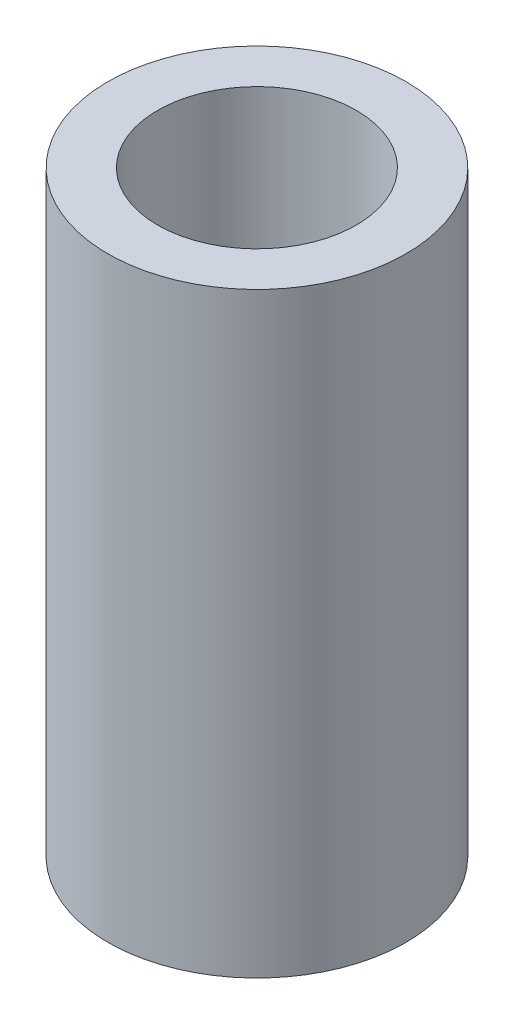
ISO-10303-21;
HEADER;
FILE_DESCRIPTION(('STEP AP214'),'2;1');
FILE_NAME('part.step','',(''),(''),'','','');
FILE_SCHEMA(('AUTOMOTIVE_DESIGN { 1 0 10303 214 1 1 1 1 }'));
ENDSEC;
DATA;
#1=APPLICATION_CONTEXT('core data for automotive mechanical design processes');
#2=APPLICATION_PROTOCOL_DEFINITION('international standard','automotive_design',2000,#1);
#3=PRODUCT_CONTEXT('',#1,'mechanical');
#4=PRODUCT('Part','Part','',(#3));
#5=PRODUCT_RELATED_PRODUCT_CATEGORY('part','',(#4));
#6=PRODUCT_DEFINITION_FORMATION('','',#4);
#7=PRODUCT_DEFINITION_CONTEXT('part definition',#1,'design');
#8=PRODUCT_DEFINITION('design','',#6,#7);
#9=PRODUCT_DEFINITION_SHAPE('','',#8);
#10=(LENGTH_UNIT() NAMED_UNIT(*) SI_UNIT(.MILLI.,.METRE.));
#11=(NAMED_UNIT(*) PLANE_ANGLE_UNIT() SI_UNIT($,.RADIAN.));
#12=(NAMED_UNIT(*) SI_UNIT($,.STERADIAN.) SOLID_ANGLE_UNIT());
#13=UNCERTAINTY_MEASURE_WITH_UNIT(LENGTH_MEASURE(1.E-05),#10,'distance_accuracy_value','');
#14=(GEOMETRIC_REPRESENTATION_CONTEXT(3) GLOBAL_UNCERTAINTY_ASSIGNED_CONTEXT((#13)) GLOBAL_UNIT_ASSIGNED_CONTEXT((#10,
#11,#12)) REPRESENTATION_CONTEXT('',''));
#15=CARTESIAN_POINT('',(0.,0.,0.));
#16=DIRECTION('',(0.,0.,1.));
#17=DIRECTION('',(1.,0.,0.));
#18=AXIS2_PLACEMENT_3D('',#15,#16,#17);
#19=CARTESIAN_POINT('',(0.,19.05,0.));
#20=DIRECTION('',(0.,1.,0.));
#21=DIRECTION('',(0.,0.,1.));
#22=AXIS2_PLACEMENT_3D('',#19,#20,#21);
#23=PLANE('',#22);
#24=CARTESIAN_POINT('',(0.,19.05,0.));
#25=DIRECTION('',(0.,1.,0.));
#26=DIRECTION('',(0.,0.,1.));
#27=AXIS2_PLACEMENT_3D('',#24,#25,#26);
#28=CIRCLE('',#27,4.7625);
#29=CARTESIAN_POINT('',(0.,19.05,-4.7625));
#30=VERTEX_POINT('',#29);
#31=EDGE_CURVE('E10',#30,#30,#28,.T.);
#32=ORIENTED_EDGE('',*,*,#31,.T.);
#33=EDGE_LOOP('',(#32));
#34=FACE_BOUND('',#33,.T.);
#35=CARTESIAN_POINT('',(0.,19.05,0.));
#36=DIRECTION('',(0.,1.,0.));
#37=DIRECTION('',(0.,0.,1.));
#38=AXIS2_PLACEMENT_3D('',#35,#36,#37);
#39=CIRCLE('',#38,3.175);
#40=CARTESIAN_POINT('',(0.,19.05,-3.175));
#41=VERTEX_POINT('',#40);
#42=EDGE_CURVE('E42',#41,#41,#39,.T.);
#43=ORIENTED_EDGE('',*,*,#42,.F.);
#44=EDGE_LOOP('',(#43));
#45=FACE_BOUND('',#44,.T.);
#46=ADVANCED_FACE('F31',(#34,#45),#23,.T.);
#47=CARTESIAN_POINT('',(0.,0.,0.));
#48=DIRECTION('',(0.,1.,0.));
#49=DIRECTION('',(0.,0.,1.));
#50=AXIS2_PLACEMENT_3D('',#47,#48,#49);
#51=PLANE('',#50);
#52=CARTESIAN_POINT('',(0.,0.,0.));
#53=DIRECTION('',(0.,1.,0.));
#54=DIRECTION('',(0.,0.,1.));
#55=AXIS2_PLACEMENT_3D('',#52,#53,#54);
#56=CIRCLE('',#55,4.7625);
#57=CARTESIAN_POINT('',(0.,0.,-4.7625));
#58=VERTEX_POINT('',#57);
#59=EDGE_CURVE('E35',#58,#58,#56,.T.);
#60=ORIENTED_EDGE('',*,*,#59,.F.);
#61=EDGE_LOOP('',(#60));
#62=FACE_BOUND('',#61,.T.);
#63=CARTESIAN_POINT('',(0.,0.,0.));
#64=DIRECTION('',(0.,1.,0.));
#65=DIRECTION('',(0.,0.,1.));
#66=AXIS2_PLACEMENT_3D('',#63,#64,#65);
#67=CIRCLE('',#66,3.175);
#68=CARTESIAN_POINT('',(0.,0.,-3.175));
#69=VERTEX_POINT('',#68);
#70=EDGE_CURVE('E44',#69,#69,#67,.T.);
#71=ORIENTED_EDGE('',*,*,#70,.T.);
#72=EDGE_LOOP('',(#71));
#73=FACE_BOUND('',#72,.T.);
#74=ADVANCED_FACE('F54',(#62,#73),#51,.F.);
#75=CARTESIAN_POINT('',(0.,19.05,0.));
#76=DIRECTION('',(0.,-1.,0.));
#77=DIRECTION('',(0.,0.,-1.));
#78=AXIS2_PLACEMENT_3D('',#75,#76,#77);
#79=CYLINDRICAL_SURFACE('',#78,4.7625);
#80=CARTESIAN_POINT('',(0.,19.05,-4.7625));
#81=CARTESIAN_POINT('',(0.,18.8515625,-4.7625));
#82=CARTESIAN_POINT('',(0.,18.653125,-4.7625));
#83=CARTESIAN_POINT('',(0.,18.25625,-4.7625));
#84=CARTESIAN_POINT('',(0.,18.0578125,-4.7625));
#85=CARTESIAN_POINT('',(0.,17.6609375,-4.7625));
#86=CARTESIAN_POINT('',(0.,17.4625,-4.7625));
#87=CARTESIAN_POINT('',(0.,17.065625,-4.7625));
#88=CARTESIAN_POINT('',(0.,16.8671875,-4.7625));
#89=CARTESIAN_POINT('',(0.,16.4703125,-4.7625));
#90=CARTESIAN_POINT('',(0.,16.271875,-4.7625));
#91=CARTESIAN_POINT('',(0.,15.875,-4.7625));
#92=CARTESIAN_POINT('',(0.,15.6765625,-4.7625));
#93=CARTESIAN_POINT('',(0.,15.2796875,-4.7625));
#94=CARTESIAN_POINT('',(0.,15.08125,-4.7625));
#95=CARTESIAN_POINT('',(0.,14.684375,-4.7625));
#96=CARTESIAN_POINT('',(0.,14.4859375,-4.7625));
#97=CARTESIAN_POINT('',(0.,14.0890625,-4.7625));
#98=CARTESIAN_POINT('',(0.,13.890625,-4.7625));
#99=CARTESIAN_POINT('',(0.,13.49375,-4.7625));
#100=CARTESIAN_POINT('',(0.,13.2953125,-4.7625));
#101=CARTESIAN_POINT('',(0.,12.8984375,-4.7625));
#102=CARTESIAN_POINT('',(0.,12.7,-4.7625));
#103=CARTESIAN_POINT('',(0.,12.303125,-4.7625));
#104=CARTESIAN_POINT('',(0.,12.1046875,-4.7625));
#105=CARTESIAN_POINT('',(0.,11.7078125,-4.7625));
#106=CARTESIAN_POINT('',(0.,11.509375,-4.7625));
#107=CARTESIAN_POINT('',(0.,11.1125,-4.7625));
#108=CARTESIAN_POINT('',(0.,10.9140625,-4.7625));
#109=CARTESIAN_POINT('',(0.,10.5171875,-4.7625));
#110=CARTESIAN_POINT('',(0.,10.31875,-4.7625));
#111=CARTESIAN_POINT('',(0.,9.921875,-4.7625));
#112=CARTESIAN_POINT('',(0.,9.7234375,-4.7625));
#113=CARTESIAN_POINT('',(0.,9.3265625,-4.7625));
#114=CARTESIAN_POINT('',(0.,9.128125,-4.7625));
#115=CARTESIAN_POINT('',(0.,8.73125,-4.7625));
#116=CARTESIAN_POINT('',(0.,8.5328125,-4.7625));
#117=CARTESIAN_POINT('',(0.,8.1359375,-4.7625));
#118=CARTESIAN_POINT('',(0.,7.9375,-4.7625));
#119=CARTESIAN_POINT('',(0.,7.540625,-4.7625));
#120=CARTESIAN_POINT('',(0.,7.3421875,-4.7625));
#121=CARTESIAN_POINT('',(0.,6.9453125,-4.7625));
#122=CARTESIAN_POINT('',(0.,6.746875,-4.7625));
#123=CARTESIAN_POINT('',(0.,6.35,-4.7625));
#124=CARTESIAN_POINT('',(0.,6.1515625,-4.7625));
#125=CARTESIAN_POINT('',(0.,5.7546875,-4.7625));
#126=CARTESIAN_POINT('',(0.,5.55625,-4.7625));
#127=CARTESIAN_POINT('',(0.,5.159375,-4.7625));
#128=CARTESIAN_POINT('',(0.,4.9609375,-4.7625));
#129=CARTESIAN_POINT('',(0.,4.5640625,-4.7625));
#130=CARTESIAN_POINT('',(0.,4.365625,-4.7625));
#131=CARTESIAN_POINT('',(0.,3.96875,-4.7625));
#132=CARTESIAN_POINT('',(0.,3.7703125,-4.7625));
#133=CARTESIAN_POINT('',(0.,3.3734375,-4.7625));
#134=CARTESIAN_POINT('',(0.,3.175,-4.7625));
#135=CARTESIAN_POINT('',(0.,2.778125,-4.7625));
#136=CARTESIAN_POINT('',(0.,2.5796875,-4.7625));
#137=CARTESIAN_POINT('',(0.,2.1828125,-4.7625));
#138=CARTESIAN_POINT('',(0.,1.984375,-4.7625));
#139=CARTESIAN_POINT('',(0.,1.5875,-4.7625));
#140=CARTESIAN_POINT('',(0.,1.3890625,-4.7625));
#141=CARTESIAN_POINT('',(0.,0.992187500000001,-4.7625));
#142=CARTESIAN_POINT('',(0.,0.793750000000001,-4.7625));
#143=CARTESIAN_POINT('',(0.,0.396875,-4.7625));
#144=CARTESIAN_POINT('',(0.,0.1984375,-4.7625));
#145=CARTESIAN_POINT('',(0.,0.,-4.7625));
#146=B_SPLINE_CURVE_WITH_KNOTS('',3,(#80,#81,#82,#83,#84,#85,#86,#87,#88,#89,#90,#91,#92,#93,
#94,#95,#96,#97,#98,#99,#100,#101,#102,#103,#104,#105,#106,#107,#108,#109,#110,#111,#112,#113,
#114,#115,#116,#117,#118,#119,#120,#121,#122,#123,#124,#125,#126,#127,#128,#129,#130,#131,#132,
#133,#134,#135,#136,#137,#138,#139,#140,#141,#142,#143,#144,#145),.UNSPECIFIED.,.F.,.F.,(4,2,2,
2,2,2,2,2,2,2,2,2,2,2,2,2,2,2,2,2,2,2,2,2,2,2,2,2,2,2,2,2,4),(0.,0.5953125,1.190625,1.7859375,
2.38125,2.9765625,3.571875,4.1671875,4.7625,5.3578125,5.953125,6.5484375,7.14375,7.7390625,
8.334375,8.9296875,9.525,10.1203125,10.715625,11.3109375,11.90625,12.5015625,13.096875,
13.6921875,14.2875,14.8828125,15.478125,16.0734375,16.66875,17.2640625,17.859375,18.4546875,
19.05),.UNSPECIFIED.);
#147=EDGE_CURVE('BSEAM33',#30,#58,#146,.T.);
#148=ORIENTED_EDGE('',*,*,#31,.F.);
#149=ORIENTED_EDGE('',*,*,#59,.T.);
#150=ORIENTED_EDGE('',*,*,#147,.T.);
#151=ORIENTED_EDGE('',*,*,#147,.F.);
#152=EDGE_LOOP('',(#148,#150,#149,#151));
#153=FACE_BOUND('',#152,.T.);
#154=ADVANCED_FACE('F33',(#153),#79,.T.);
#155=CARTESIAN_POINT('',(0.,19.05,0.));
#156=DIRECTION('',(0.,-1.,0.));
#157=DIRECTION('',(0.,0.,-1.));
#158=AXIS2_PLACEMENT_3D('',#155,#156,#157);
#159=CYLINDRICAL_SURFACE('',#158,3.175);
#160=CARTESIAN_POINT('',(0.,19.05,-3.175));
#161=CARTESIAN_POINT('',(0.,18.8515625,-3.175));
#162=CARTESIAN_POINT('',(0.,18.653125,-3.175));
#163=CARTESIAN_POINT('',(0.,18.25625,-3.175));
#164=CARTESIAN_POINT('',(0.,18.0578125,-3.175));
#165=CARTESIAN_POINT('',(0.,17.6609375,-3.175));
#166=CARTESIAN_POINT('',(0.,17.4625,-3.175));
#167=CARTESIAN_POINT('',(0.,17.065625,-3.175));
#168=CARTESIAN_POINT('',(0.,16.8671875,-3.175));
#169=CARTESIAN_POINT('',(0.,16.4703125,-3.175));
#170=CARTESIAN_POINT('',(0.,16.271875,-3.175));
#171=CARTESIAN_POINT('',(0.,15.875,-3.175));
#172=CARTESIAN_POINT('',(0.,15.6765625,-3.175));
#173=CARTESIAN_POINT('',(0.,15.2796875,-3.175));
#174=CARTESIAN_POINT('',(0.,15.08125,-3.175));
#175=CARTESIAN_POINT('',(0.,14.684375,-3.175));
#176=CARTESIAN_POINT('',(0.,14.4859375,-3.175));
#177=CARTESIAN_POINT('',(0.,14.0890625,-3.175));
#178=CARTESIAN_POINT('',(0.,13.890625,-3.175));
#179=CARTESIAN_POINT('',(0.,13.49375,-3.175));
#180=CARTESIAN_POINT('',(0.,13.2953125,-3.175));
#181=CARTESIAN_POINT('',(0.,12.8984375,-3.175));
#182=CARTESIAN_POINT('',(0.,12.7,-3.175));
#183=CARTESIAN_POINT('',(0.,12.303125,-3.175));
#184=CARTESIAN_POINT('',(0.,12.1046875,-3.175));
#185=CARTESIAN_POINT('',(0.,11.7078125,-3.175));
#186=CARTESIAN_POINT('',(0.,11.509375,-3.175));
#187=CARTESIAN_POINT('',(0.,11.1125,-3.175));
#188=CARTESIAN_POINT('',(0.,10.9140625,-3.175));
#189=CARTESIAN_POINT('',(0.,10.5171875,-3.175));
#190=CARTESIAN_POINT('',(0.,10.31875,-3.175));
#191=CARTESIAN_POINT('',(0.,9.921875,-3.175));
#192=CARTESIAN_POINT('',(0.,9.7234375,-3.175));
#193=CARTESIAN_POINT('',(0.,9.3265625,-3.175));
#194=CARTESIAN_POINT('',(0.,9.128125,-3.175));
#195=CARTESIAN_POINT('',(0.,8.73125,-3.175));
#196=CARTESIAN_POINT('',(0.,8.5328125,-3.175));
#197=CARTESIAN_POINT('',(0.,8.1359375,-3.175));
#198=CARTESIAN_POINT('',(0.,7.9375,-3.175));
#199=CARTESIAN_POINT('',(0.,7.540625,-3.175));
#200=CARTESIAN_POINT('',(0.,7.3421875,-3.175));
#201=CARTESIAN_POINT('',(0.,6.9453125,-3.175));
#202=CARTESIAN_POINT('',(0.,6.746875,-3.175));
#203=CARTESIAN_POINT('',(0.,6.35,-3.175));
#204=CARTESIAN_POINT('',(0.,6.1515625,-3.175));
#205=CARTESIAN_POINT('',(0.,5.7546875,-3.175));
#206=CARTESIAN_POINT('',(0.,5.55625,-3.175));
#207=CARTESIAN_POINT('',(0.,5.159375,-3.175));
#208=CARTESIAN_POINT('',(0.,4.9609375,-3.175));
#209=CARTESIAN_POINT('',(0.,4.5640625,-3.175));
#210=CARTESIAN_POINT('',(0.,4.365625,-3.175));
#211=CARTESIAN_POINT('',(0.,3.96875,-3.175));
#212=CARTESIAN_POINT('',(0.,3.7703125,-3.175));
#213=CARTESIAN_POINT('',(0.,3.3734375,-3.175));
#214=CARTESIAN_POINT('',(0.,3.175,-3.175));
#215=CARTESIAN_POINT('',(0.,2.778125,-3.175));
#216=CARTESIAN_POINT('',(0.,2.5796875,-3.175));
#217=CARTESIAN_POINT('',(0.,2.1828125,-3.175));
#218=CARTESIAN_POINT('',(0.,1.984375,-3.175));
#219=CARTESIAN_POINT('',(0.,1.5875,-3.175));
#220=CARTESIAN_POINT('',(0.,1.3890625,-3.175));
#221=CARTESIAN_POINT('',(0.,0.992187500000001,-3.175));
#222=CARTESIAN_POINT('',(0.,0.793750000000001,-3.175));
#223=CARTESIAN_POINT('',(0.,0.396875,-3.175));
#224=CARTESIAN_POINT('',(0.,0.1984375,-3.175));
#225=CARTESIAN_POINT('',(0.,0.,-3.175));
#226=B_SPLINE_CURVE_WITH_KNOTS('',3,(#160,#161,#162,#163,#164,#165,#166,#167,#168,#169,#170,
#171,#172,#173,#174,#175,#176,#177,#178,#179,#180,#181,#182,#183,#184,#185,#186,#187,#188,#189,
#190,#191,#192,#193,#194,#195,#196,#197,#198,#199,#200,#201,#202,#203,#204,#205,#206,#207,#208,
#209,#210,#211,#212,#213,#214,#215,#216,#217,#218,#219,#220,#221,#222,#223,#224,#225),
.UNSPECIFIED.,.F.,.F.,(4,2,2,2,2,2,2,2,2,2,2,2,2,2,2,2,2,2,2,2,2,2,2,2,2,2,2,2,2,2,2,2,4),(0.,
0.595312499999997,1.190625,1.7859375,2.38125,2.9765625,3.571875,4.1671875,4.7625,5.3578125,
5.953125,6.5484375,7.14375,7.7390625,8.334375,8.9296875,9.525,10.1203125,10.715625,11.3109375,
11.90625,12.5015625,13.096875,13.6921875,14.2875,14.8828125,15.478125,16.0734375,16.66875,
17.2640625,17.859375,18.4546875,19.05),.UNSPECIFIED.);
#227=EDGE_CURVE('BSEAM50',#41,#69,#226,.T.);
#228=ORIENTED_EDGE('',*,*,#42,.T.);
#229=ORIENTED_EDGE('',*,*,#70,.F.);
#230=ORIENTED_EDGE('',*,*,#227,.T.);
#231=ORIENTED_EDGE('',*,*,#227,.F.);
#232=EDGE_LOOP('',(#228,#230,#229,#231));
#233=FACE_BOUND('',#232,.T.);
#234=ADVANCED_FACE('F50',(#233),#159,.F.);
#235=CLOSED_SHELL('',(#46,#74,#154,#234));
#236=MANIFOLD_SOLID_BREP('B2',#235);
#237=ADVANCED_BREP_SHAPE_REPRESENTATION('',(#18,#236),#14);
#238=SHAPE_DEFINITION_REPRESENTATION(#9,#237);
ENDSEC;
END-ISO-10303-21;
